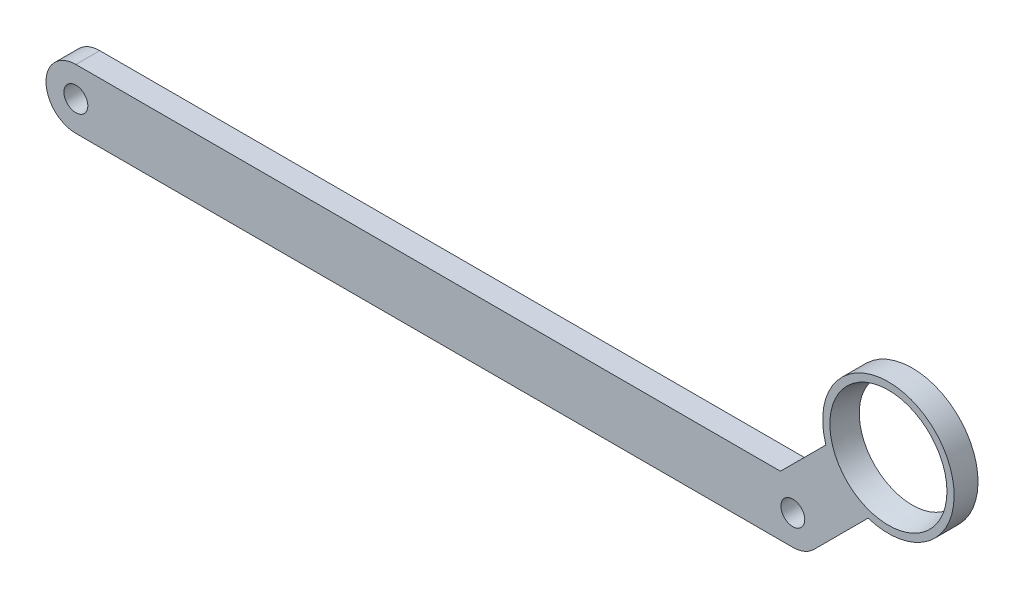
ISO-10303-21;
HEADER;
FILE_DESCRIPTION(('STEP AP214'),'2;1');
FILE_NAME('part.step','',(''),(''),'','','');
FILE_SCHEMA(('AUTOMOTIVE_DESIGN { 1 0 10303 214 1 1 1 1 }'));
ENDSEC;
DATA;
#1=APPLICATION_CONTEXT('core data for automotive mechanical design processes');
#2=APPLICATION_PROTOCOL_DEFINITION('international standard','automotive_design',2000,#1);
#3=PRODUCT_CONTEXT('',#1,'mechanical');
#4=PRODUCT('Part','Part','',(#3));
#5=PRODUCT_RELATED_PRODUCT_CATEGORY('part','',(#4));
#6=PRODUCT_DEFINITION_FORMATION('','',#4);
#7=PRODUCT_DEFINITION_CONTEXT('part definition',#1,'design');
#8=PRODUCT_DEFINITION('design','',#6,#7);
#9=PRODUCT_DEFINITION_SHAPE('','',#8);
#10=(LENGTH_UNIT() NAMED_UNIT(*) SI_UNIT(.MILLI.,.METRE.));
#11=(NAMED_UNIT(*) PLANE_ANGLE_UNIT() SI_UNIT($,.RADIAN.));
#12=(NAMED_UNIT(*) SI_UNIT($,.STERADIAN.) SOLID_ANGLE_UNIT());
#13=UNCERTAINTY_MEASURE_WITH_UNIT(LENGTH_MEASURE(1.E-05),#10,'distance_accuracy_value','');
#14=(GEOMETRIC_REPRESENTATION_CONTEXT(3) GLOBAL_UNCERTAINTY_ASSIGNED_CONTEXT((#13)) GLOBAL_UNIT_ASSIGNED_CONTEXT((#10,
#11,#12)) REPRESENTATION_CONTEXT('',''));
#15=CARTESIAN_POINT('',(0.,0.,0.));
#16=DIRECTION('',(0.,0.,1.));
#17=DIRECTION('',(1.,0.,0.));
#18=AXIS2_PLACEMENT_3D('',#15,#16,#17);
#19=CARTESIAN_POINT('',(-45.0000000000001,0.,4.));
#20=DIRECTION('',(0.,0.,-1.));
#21=DIRECTION('',(-1.,0.,0.));
#22=AXIS2_PLACEMENT_3D('',#19,#20,#21);
#23=CYLINDRICAL_SURFACE('',#22,4.99999999999996);
#24=CARTESIAN_POINT('',(-45.0000000000001,0.,0.));
#25=DIRECTION('',(0.,0.,1.));
#26=DIRECTION('',(1.,0.,0.));
#27=AXIS2_PLACEMENT_3D('',#24,#25,#26);
#28=CIRCLE('',#27,4.99999999999996);
#29=CARTESIAN_POINT('',(-45.0000000000001,4.99999999999996,0.));
#30=VERTEX_POINT('',#29);
#31=CARTESIAN_POINT('',(-45.0000000000001,-4.99999999999996,0.));
#32=VERTEX_POINT('',#31);
#33=EDGE_CURVE('E131',#30,#32,#28,.T.);
#34=ORIENTED_EDGE('',*,*,#33,.T.);
#35=DIRECTION('',(0.,0.,-1.));
#36=VECTOR('',#35,1.);
#37=CARTESIAN_POINT('',(-45.0000000000001,-4.99999999999996,4.));
#38=LINE('',#37,#36);
#39=CARTESIAN_POINT('',(-45.0000000000001,-4.99999999999996,4.));
#40=VERTEX_POINT('',#39);
#41=EDGE_CURVE('E11',#40,#32,#38,.T.);
#42=ORIENTED_EDGE('',*,*,#41,.F.);
#43=CARTESIAN_POINT('',(-45.0000000000001,0.,4.));
#44=DIRECTION('',(0.,0.,1.));
#45=DIRECTION('',(1.,0.,0.));
#46=AXIS2_PLACEMENT_3D('',#43,#44,#45);
#47=CIRCLE('',#46,4.99999999999996);
#48=CARTESIAN_POINT('',(-45.0000000000001,4.99999999999996,4.));
#49=VERTEX_POINT('',#48);
#50=EDGE_CURVE('E88',#49,#40,#47,.T.);
#51=ORIENTED_EDGE('',*,*,#50,.F.);
#52=DIRECTION('',(0.,0.,-1.));
#53=VECTOR('',#52,1.);
#54=CARTESIAN_POINT('',(-45.0000000000001,4.99999999999996,4.));
#55=LINE('',#54,#53);
#56=EDGE_CURVE('E130',#49,#30,#55,.T.);
#57=ORIENTED_EDGE('',*,*,#56,.T.);
#58=EDGE_LOOP('',(#34,#42,#51,#57));
#59=FACE_BOUND('',#58,.T.);
#60=ADVANCED_FACE('F35',(#59),#23,.T.);
#61=CARTESIAN_POINT('',(0.,-4.99999999999995,4.));
#62=DIRECTION('',(0.,-1.,0.));
#63=DIRECTION('',(1.,0.,0.));
#64=AXIS2_PLACEMENT_3D('',#61,#62,#63);
#65=PLANE('',#64);
#66=DIRECTION('',(-1.,0.,0.));
#67=VECTOR('',#66,1.);
#68=CARTESIAN_POINT('',(0.,-4.99999999999995,0.));
#69=LINE('',#68,#67);
#70=CARTESIAN_POINT('',(74.9999999999999,-4.99999999999995,0.));
#71=VERTEX_POINT('',#70);
#72=EDGE_CURVE('E134',#71,#32,#69,.T.);
#73=ORIENTED_EDGE('',*,*,#72,.F.);
#74=DIRECTION('',(0.,0.,-1.));
#75=VECTOR('',#74,1.);
#76=CARTESIAN_POINT('',(74.9999999999999,-4.99999999999995,4.));
#77=LINE('',#76,#75);
#78=CARTESIAN_POINT('',(74.9999999999999,-4.99999999999995,4.));
#79=VERTEX_POINT('',#78);
#80=EDGE_CURVE('E43',#79,#71,#77,.T.);
#81=ORIENTED_EDGE('',*,*,#80,.F.);
#82=DIRECTION('',(-1.,0.,0.));
#83=VECTOR('',#82,1.);
#84=CARTESIAN_POINT('',(0.,-4.99999999999995,4.));
#85=LINE('',#84,#83);
#86=EDGE_CURVE('E171',#79,#40,#85,.T.);
#87=ORIENTED_EDGE('',*,*,#86,.T.);
#88=ORIENTED_EDGE('',*,*,#41,.T.);
#89=EDGE_LOOP('',(#73,#81,#87,#88));
#90=FACE_BOUND('',#89,.T.);
#91=ADVANCED_FACE('F170',(#90),#65,.T.);
#92=CARTESIAN_POINT('',(74.9999999999999,0.,4.));
#93=DIRECTION('',(0.,0.,-1.));
#94=DIRECTION('',(-1.,0.,0.));
#95=AXIS2_PLACEMENT_3D('',#92,#93,#94);
#96=CYLINDRICAL_SURFACE('',#95,4.99999999999995);
#97=CARTESIAN_POINT('',(74.9999999999999,0.,0.));
#98=DIRECTION('',(0.,0.,1.));
#99=DIRECTION('',(1.,0.,0.));
#100=AXIS2_PLACEMENT_3D('',#97,#98,#99);
#101=CIRCLE('',#100,4.99999999999995);
#102=CARTESIAN_POINT('',(78.5355339059326,-3.53553390593269,0.));
#103=VERTEX_POINT('',#102);
#104=EDGE_CURVE('E138',#71,#103,#101,.T.);
#105=ORIENTED_EDGE('',*,*,#104,.T.);
#106=DIRECTION('',(0.,0.,-1.));
#107=VECTOR('',#106,1.);
#108=CARTESIAN_POINT('',(78.5355339059326,-3.53553390593269,4.));
#109=LINE('',#108,#107);
#110=CARTESIAN_POINT('',(78.5355339059326,-3.53553390593269,4.));
#111=VERTEX_POINT('',#110);
#112=EDGE_CURVE('E154',#111,#103,#109,.T.);
#113=ORIENTED_EDGE('',*,*,#112,.F.);
#114=CARTESIAN_POINT('',(74.9999999999999,0.,4.));
#115=DIRECTION('',(0.,0.,1.));
#116=DIRECTION('',(1.,0.,0.));
#117=AXIS2_PLACEMENT_3D('',#114,#115,#116);
#118=CIRCLE('',#117,4.99999999999995);
#119=EDGE_CURVE('E161',#79,#111,#118,.T.);
#120=ORIENTED_EDGE('',*,*,#119,.F.);
#121=ORIENTED_EDGE('',*,*,#80,.T.);
#122=EDGE_LOOP('',(#105,#113,#120,#121));
#123=FACE_BOUND('',#122,.T.);
#124=ADVANCED_FACE('F159',(#123),#96,.T.);
#125=CARTESIAN_POINT('',(41.0355339059328,-41.0355339059326,4.));
#126=DIRECTION('',(-0.707106781186549,0.707106781186546,0.));
#127=DIRECTION('',(-0.707106781186546,-0.707106781186549,0.));
#128=AXIS2_PLACEMENT_3D('',#125,#126,#127);
#129=PLANE('',#128);
#130=DIRECTION('',(0.707106781186546,0.707106781186549,0.));
#131=VECTOR('',#130,1.);
#132=CARTESIAN_POINT('',(41.0355339059328,-41.0355339059326,0.));
#133=LINE('',#132,#131);
#134=CARTESIAN_POINT('',(87.6073306756571,5.53626286379182,0.));
#135=VERTEX_POINT('',#134);
#136=EDGE_CURVE('E140',#103,#135,#133,.T.);
#137=ORIENTED_EDGE('',*,*,#136,.T.);
#138=DIRECTION('',(0.,0.,-1.));
#139=VECTOR('',#138,1.);
#140=CARTESIAN_POINT('',(87.6073306756571,5.53626286379182,4.));
#141=LINE('',#140,#139);
#142=CARTESIAN_POINT('',(87.6073306756571,5.53626286379182,4.));
#143=VERTEX_POINT('',#142);
#144=EDGE_CURVE('E116',#143,#135,#141,.T.);
#145=ORIENTED_EDGE('',*,*,#144,.F.);
#146=DIRECTION('',(0.707106781186546,0.707106781186549,0.));
#147=VECTOR('',#146,1.);
#148=CARTESIAN_POINT('',(41.0355339059328,-41.0355339059326,4.));
#149=LINE('',#148,#147);
#150=EDGE_CURVE('E107',#111,#143,#149,.T.);
#151=ORIENTED_EDGE('',*,*,#150,.F.);
#152=ORIENTED_EDGE('',*,*,#112,.T.);
#153=EDGE_LOOP('',(#137,#145,#151,#152));
#154=FACE_BOUND('',#153,.T.);
#155=ADVANCED_FACE('F194',(#154),#129,.F.);
#156=CARTESIAN_POINT('',(90.9999999999999,16.,4.));
#157=DIRECTION('',(0.,0.,-1.));
#158=DIRECTION('',(-1.,0.,0.));
#159=AXIS2_PLACEMENT_3D('',#156,#157,#158);
#160=CYLINDRICAL_SURFACE('',#159,11.);
#161=CARTESIAN_POINT('',(90.9999999999999,16.,0.));
#162=DIRECTION('',(0.,0.,1.));
#163=DIRECTION('',(1.,0.,0.));
#164=AXIS2_PLACEMENT_3D('',#161,#162,#163);
#165=CIRCLE('',#164,11.);
#166=CARTESIAN_POINT('',(80.5362628637917,12.6073306756572,0.));
#167=VERTEX_POINT('',#166);
#168=EDGE_CURVE('E115',#135,#167,#165,.T.);
#169=ORIENTED_EDGE('',*,*,#168,.T.);
#170=DIRECTION('',(0.,0.,-1.));
#171=VECTOR('',#170,1.);
#172=CARTESIAN_POINT('',(80.5362628637917,12.6073306756572,4.));
#173=LINE('',#172,#171);
#174=CARTESIAN_POINT('',(80.5362628637917,12.6073306756572,4.));
#175=VERTEX_POINT('',#174);
#176=EDGE_CURVE('E112',#175,#167,#173,.T.);
#177=ORIENTED_EDGE('',*,*,#176,.F.);
#178=CARTESIAN_POINT('',(90.9999999999999,16.,4.));
#179=DIRECTION('',(0.,0.,1.));
#180=DIRECTION('',(1.,0.,0.));
#181=AXIS2_PLACEMENT_3D('',#178,#179,#180);
#182=CIRCLE('',#181,11.);
#183=EDGE_CURVE('E100',#143,#175,#182,.T.);
#184=ORIENTED_EDGE('',*,*,#183,.F.);
#185=ORIENTED_EDGE('',*,*,#144,.T.);
#186=EDGE_LOOP('',(#169,#177,#184,#185));
#187=FACE_BOUND('',#186,.T.);
#188=ADVANCED_FACE('F113',(#187),#160,.T.);
#189=CARTESIAN_POINT('',(33.9644660940673,-33.9644660940673,4.));
#190=DIRECTION('',(0.707106781186548,-0.707106781186547,0.));
#191=DIRECTION('',(0.707106781186547,0.707106781186548,0.));
#192=AXIS2_PLACEMENT_3D('',#189,#190,#191);
#193=PLANE('',#192);
#194=DIRECTION('',(-0.707106781186547,-0.707106781186548,0.));
#195=VECTOR('',#194,1.);
#196=CARTESIAN_POINT('',(33.9644660940673,-33.9644660940673,0.));
#197=LINE('',#196,#195);
#198=CARTESIAN_POINT('',(72.9289321881345,4.99999999999994,0.));
#199=VERTEX_POINT('',#198);
#200=EDGE_CURVE('E76',#167,#199,#197,.T.);
#201=ORIENTED_EDGE('',*,*,#200,.T.);
#202=DIRECTION('',(0.,0.,-1.));
#203=VECTOR('',#202,1.);
#204=CARTESIAN_POINT('',(72.9289321881345,4.99999999999994,4.));
#205=LINE('',#204,#203);
#206=CARTESIAN_POINT('',(72.9289321881345,4.99999999999994,4.));
#207=VERTEX_POINT('',#206);
#208=EDGE_CURVE('E117',#207,#199,#205,.T.);
#209=ORIENTED_EDGE('',*,*,#208,.F.);
#210=DIRECTION('',(-0.707106781186547,-0.707106781186548,0.));
#211=VECTOR('',#210,1.);
#212=CARTESIAN_POINT('',(33.9644660940673,-33.9644660940673,4.));
#213=LINE('',#212,#211);
#214=EDGE_CURVE('E105',#175,#207,#213,.T.);
#215=ORIENTED_EDGE('',*,*,#214,.F.);
#216=ORIENTED_EDGE('',*,*,#176,.T.);
#217=EDGE_LOOP('',(#201,#209,#215,#216));
#218=FACE_BOUND('',#217,.T.);
#219=ADVANCED_FACE('F119',(#218),#193,.F.);
#220=CARTESIAN_POINT('',(74.9999999999999,0.,4.));
#221=DIRECTION('',(0.,0.,-1.));
#222=DIRECTION('',(-1.,0.,0.));
#223=AXIS2_PLACEMENT_3D('',#220,#221,#222);
#224=CYLINDRICAL_SURFACE('',#223,2.);
#225=CARTESIAN_POINT('',(74.9999999999999,0.,4.));
#226=DIRECTION('',(0.,0.,1.));
#227=DIRECTION('',(1.,0.,0.));
#228=AXIS2_PLACEMENT_3D('',#225,#226,#227);
#229=CIRCLE('',#228,2.);
#230=CARTESIAN_POINT('',(76.9999999999999,0.,4.));
#231=VERTEX_POINT('',#230);
#232=EDGE_CURVE('E127',#231,#231,#229,.T.);
#233=ORIENTED_EDGE('',*,*,#232,.T.);
#234=EDGE_LOOP('',(#233));
#235=FACE_BOUND('',#234,.T.);
#236=CARTESIAN_POINT('',(74.9999999999999,0.,0.));
#237=DIRECTION('',(0.,0.,1.));
#238=DIRECTION('',(1.,0.,0.));
#239=AXIS2_PLACEMENT_3D('',#236,#237,#238);
#240=CIRCLE('',#239,2.);
#241=CARTESIAN_POINT('',(76.9999999999999,0.,0.));
#242=VERTEX_POINT('',#241);
#243=EDGE_CURVE('E148',#242,#242,#240,.T.);
#244=ORIENTED_EDGE('',*,*,#243,.F.);
#245=EDGE_LOOP('',(#244));
#246=FACE_BOUND('',#245,.T.);
#247=ADVANCED_FACE('F183',(#235,#246),#224,.F.);
#248=CARTESIAN_POINT('',(-45.0000000000001,0.,4.));
#249=DIRECTION('',(0.,0.,-1.));
#250=DIRECTION('',(-1.,0.,0.));
#251=AXIS2_PLACEMENT_3D('',#248,#249,#250);
#252=CYLINDRICAL_SURFACE('',#251,2.);
#253=CARTESIAN_POINT('',(-45.0000000000001,0.,4.));
#254=DIRECTION('',(0.,0.,1.));
#255=DIRECTION('',(1.,0.,0.));
#256=AXIS2_PLACEMENT_3D('',#253,#254,#255);
#257=CIRCLE('',#256,2.);
#258=CARTESIAN_POINT('',(-43.0000000000001,0.,4.));
#259=VERTEX_POINT('',#258);
#260=EDGE_CURVE('E121',#259,#259,#257,.T.);
#261=ORIENTED_EDGE('',*,*,#260,.T.);
#262=EDGE_LOOP('',(#261));
#263=FACE_BOUND('',#262,.T.);
#264=CARTESIAN_POINT('',(-45.0000000000001,0.,0.));
#265=DIRECTION('',(0.,0.,1.));
#266=DIRECTION('',(1.,0.,0.));
#267=AXIS2_PLACEMENT_3D('',#264,#265,#266);
#268=CIRCLE('',#267,2.);
#269=CARTESIAN_POINT('',(-43.0000000000001,0.,0.));
#270=VERTEX_POINT('',#269);
#271=EDGE_CURVE('E145',#270,#270,#268,.T.);
#272=ORIENTED_EDGE('',*,*,#271,.F.);
#273=EDGE_LOOP('',(#272));
#274=FACE_BOUND('',#273,.T.);
#275=ADVANCED_FACE('F175',(#263,#274),#252,.F.);
#276=CARTESIAN_POINT('',(0.,4.99999999999995,4.));
#277=DIRECTION('',(0.,-1.,0.));
#278=DIRECTION('',(1.,0.,0.));
#279=AXIS2_PLACEMENT_3D('',#276,#277,#278);
#280=PLANE('',#279);
#281=DIRECTION('',(-1.,0.,0.));
#282=VECTOR('',#281,1.);
#283=CARTESIAN_POINT('',(0.,4.99999999999995,0.));
#284=LINE('',#283,#282);
#285=EDGE_CURVE('E82',#199,#30,#284,.T.);
#286=ORIENTED_EDGE('',*,*,#285,.T.);
#287=ORIENTED_EDGE('',*,*,#56,.F.);
#288=DIRECTION('',(-1.,0.,0.));
#289=VECTOR('',#288,1.);
#290=CARTESIAN_POINT('',(0.,4.99999999999995,4.));
#291=LINE('',#290,#289);
#292=EDGE_CURVE('E51',#207,#49,#291,.T.);
#293=ORIENTED_EDGE('',*,*,#292,.F.);
#294=ORIENTED_EDGE('',*,*,#208,.T.);
#295=EDGE_LOOP('',(#286,#287,#293,#294));
#296=FACE_BOUND('',#295,.T.);
#297=ADVANCED_FACE('F173',(#296),#280,.F.);
#298=CARTESIAN_POINT('',(0.,0.,4.));
#299=DIRECTION('',(0.,0.,1.));
#300=DIRECTION('',(1.,0.,0.));
#301=AXIS2_PLACEMENT_3D('',#298,#299,#300);
#302=PLANE('',#301);
#303=CARTESIAN_POINT('',(90.9999999999999,16.,4.));
#304=DIRECTION('',(0.,0.,1.));
#305=DIRECTION('',(1.,0.,0.));
#306=AXIS2_PLACEMENT_3D('',#303,#304,#305);
#307=CIRCLE('',#306,9.80000000000001);
#308=CARTESIAN_POINT('',(100.8,16.,4.));
#309=VERTEX_POINT('',#308);
#310=EDGE_CURVE('E224',#309,#309,#307,.T.);
#311=ORIENTED_EDGE('',*,*,#310,.F.);
#312=EDGE_LOOP('',(#311));
#313=FACE_BOUND('',#312,.T.);
#314=ORIENTED_EDGE('',*,*,#50,.T.);
#315=ORIENTED_EDGE('',*,*,#86,.F.);
#316=ORIENTED_EDGE('',*,*,#119,.T.);
#317=ORIENTED_EDGE('',*,*,#150,.T.);
#318=ORIENTED_EDGE('',*,*,#183,.T.);
#319=ORIENTED_EDGE('',*,*,#214,.T.);
#320=ORIENTED_EDGE('',*,*,#292,.T.);
#321=EDGE_LOOP('',(#314,#315,#316,#317,#318,#319,#320));
#322=FACE_BOUND('',#321,.T.);
#323=ORIENTED_EDGE('',*,*,#260,.F.);
#324=EDGE_LOOP('',(#323));
#325=FACE_BOUND('',#324,.T.);
#326=ORIENTED_EDGE('',*,*,#232,.F.);
#327=EDGE_LOOP('',(#326));
#328=FACE_BOUND('',#327,.T.);
#329=ADVANCED_FACE('F102',(#313,#322,#325,#328),#302,.T.);
#330=CARTESIAN_POINT('',(0.,0.,0.));
#331=DIRECTION('',(0.,0.,1.));
#332=DIRECTION('',(1.,0.,0.));
#333=AXIS2_PLACEMENT_3D('',#330,#331,#332);
#334=PLANE('',#333);
#335=CARTESIAN_POINT('',(90.9999999999999,16.,0.));
#336=DIRECTION('',(0.,0.,1.));
#337=DIRECTION('',(1.,0.,0.));
#338=AXIS2_PLACEMENT_3D('',#335,#336,#337);
#339=CIRCLE('',#338,8.87652723549775);
#340=CARTESIAN_POINT('',(99.8765272354977,16.,0.));
#341=VERTEX_POINT('',#340);
#342=EDGE_CURVE('E135',#341,#341,#339,.T.);
#343=ORIENTED_EDGE('',*,*,#342,.T.);
#344=EDGE_LOOP('',(#343));
#345=FACE_BOUND('',#344,.T.);
#346=ORIENTED_EDGE('',*,*,#33,.F.);
#347=ORIENTED_EDGE('',*,*,#285,.F.);
#348=ORIENTED_EDGE('',*,*,#200,.F.);
#349=ORIENTED_EDGE('',*,*,#168,.F.);
#350=ORIENTED_EDGE('',*,*,#136,.F.);
#351=ORIENTED_EDGE('',*,*,#104,.F.);
#352=ORIENTED_EDGE('',*,*,#72,.T.);
#353=EDGE_LOOP('',(#346,#347,#348,#349,#350,#351,#352));
#354=FACE_BOUND('',#353,.T.);
#355=ORIENTED_EDGE('',*,*,#271,.T.);
#356=EDGE_LOOP('',(#355));
#357=FACE_BOUND('',#356,.T.);
#358=ORIENTED_EDGE('',*,*,#243,.T.);
#359=EDGE_LOOP('',(#358));
#360=FACE_BOUND('',#359,.T.);
#361=ADVANCED_FACE('F168',(#345,#354,#357,#360),#334,.F.);
#362=CARTESIAN_POINT('',(90.9999999999999,16.,4.));
#363=DIRECTION('',(0.,0.,1.));
#364=DIRECTION('',(1.,0.,0.));
#365=AXIS2_PLACEMENT_3D('',#362,#363,#364);
#366=CONICAL_SURFACE('',#365,9.80000000000001,0.226892802759263);
#367=ORIENTED_EDGE('',*,*,#342,.F.);
#368=EDGE_LOOP('',(#367));
#369=FACE_BOUND('',#368,.T.);
#370=ORIENTED_EDGE('',*,*,#310,.T.);
#371=EDGE_LOOP('',(#370));
#372=FACE_BOUND('',#371,.T.);
#373=ADVANCED_FACE('F212',(#369,#372),#366,.F.);
#374=CLOSED_SHELL('',(#60,#91,#124,#155,#188,#219,#247,#275,#297,#329,#361,#373));
#375=MANIFOLD_SOLID_BREP('B2',#374);
#376=ADVANCED_BREP_SHAPE_REPRESENTATION('',(#18,#375),#14);
#377=SHAPE_DEFINITION_REPRESENTATION(#9,#376);
ENDSEC;
END-ISO-10303-21;
